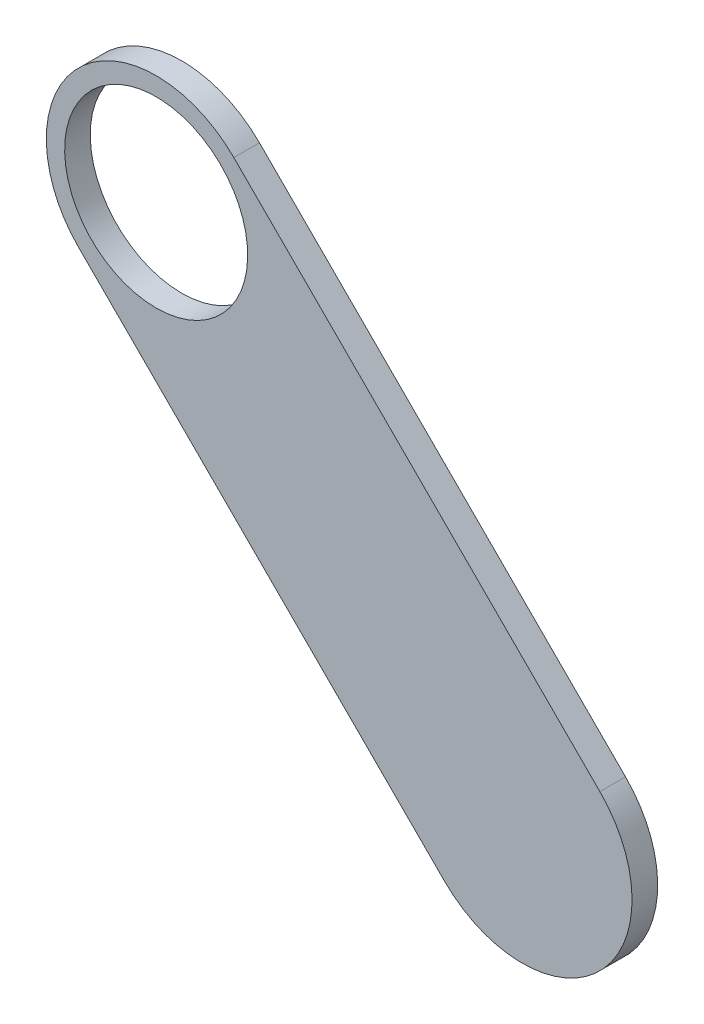
ISO-10303-21;
HEADER;
FILE_DESCRIPTION(('STEP AP214'),'2;1');
FILE_NAME('part.step','',(''),(''),'','','');
FILE_SCHEMA(('AUTOMOTIVE_DESIGN { 1 0 10303 214 1 1 1 1 }'));
ENDSEC;
DATA;
#1=APPLICATION_CONTEXT('core data for automotive mechanical design processes');
#2=APPLICATION_PROTOCOL_DEFINITION('international standard','automotive_design',2000,#1);
#3=PRODUCT_CONTEXT('',#1,'mechanical');
#4=PRODUCT('Part','Part','',(#3));
#5=PRODUCT_RELATED_PRODUCT_CATEGORY('part','',(#4));
#6=PRODUCT_DEFINITION_FORMATION('','',#4);
#7=PRODUCT_DEFINITION_CONTEXT('part definition',#1,'design');
#8=PRODUCT_DEFINITION('design','',#6,#7);
#9=PRODUCT_DEFINITION_SHAPE('','',#8);
#10=(LENGTH_UNIT() NAMED_UNIT(*) SI_UNIT(.MILLI.,.METRE.));
#11=(NAMED_UNIT(*) PLANE_ANGLE_UNIT() SI_UNIT($,.RADIAN.));
#12=(NAMED_UNIT(*) SI_UNIT($,.STERADIAN.) SOLID_ANGLE_UNIT());
#13=UNCERTAINTY_MEASURE_WITH_UNIT(LENGTH_MEASURE(1.E-05),#10,'distance_accuracy_value','');
#14=(GEOMETRIC_REPRESENTATION_CONTEXT(3) GLOBAL_UNCERTAINTY_ASSIGNED_CONTEXT((#13)) GLOBAL_UNIT_ASSIGNED_CONTEXT((#10,
#11,#12)) REPRESENTATION_CONTEXT('',''));
#15=CARTESIAN_POINT('',(0.,0.,0.));
#16=DIRECTION('',(0.,0.,1.));
#17=DIRECTION('',(1.,0.,0.));
#18=AXIS2_PLACEMENT_3D('',#15,#16,#17);
#19=CARTESIAN_POINT('',(95.8,-131.,-0.045));
#20=DIRECTION('',(0.,0.,-1.));
#21=DIRECTION('',(0.,-1.,0.));
#22=AXIS2_PLACEMENT_3D('',#19,#20,#21);
#23=CYLINDRICAL_SURFACE('',#22,0.125);
#24=CARTESIAN_POINT('',(95.8,-131.,1.6));
#25=DIRECTION('',(0.,0.,-1.));
#26=DIRECTION('',(0.,-1.,0.));
#27=AXIS2_PLACEMENT_3D('',#24,#25,#26);
#28=CIRCLE('',#27,0.125);
#29=CARTESIAN_POINT('',(95.8,-131.125,1.6));
#30=VERTEX_POINT('',#29);
#31=EDGE_CURVE('E70',#30,#30,#28,.T.);
#32=ORIENTED_EDGE('',*,*,#31,.T.);
#33=DIRECTION('',(0.,0.,1.));
#34=VECTOR('',#33,1.);
#35=CARTESIAN_POINT('',(95.8,-131.125,-0.045));
#36=LINE('',#35,#34);
#37=CARTESIAN_POINT('',(95.8,-131.125,1.635));
#38=VERTEX_POINT('',#37);
#39=EDGE_CURVE('E11',#30,#38,#36,.T.);
#40=ORIENTED_EDGE('',*,*,#39,.T.);
#41=CARTESIAN_POINT('',(95.8,-131.,1.635));
#42=DIRECTION('',(0.,0.,-1.));
#43=DIRECTION('',(0.,-1.,0.));
#44=AXIS2_PLACEMENT_3D('',#41,#42,#43);
#45=CIRCLE('',#44,0.125);
#46=EDGE_CURVE('E26',#38,#38,#45,.T.);
#47=ORIENTED_EDGE('',*,*,#46,.F.);
#48=ORIENTED_EDGE('',*,*,#39,.F.);
#49=EDGE_LOOP('',(#32,#40,#47,#48));
#50=FACE_BOUND('',#49,.T.);
#51=ADVANCED_FACE('F17',(#50),#23,.F.);
#52=CARTESIAN_POINT('',(96.406066,-131.393933,1.6));
#53=DIRECTION('',(-0.707106781186548,-0.707106781186548,0.));
#54=DIRECTION('',(-0.707106781186548,0.707106781186548,0.));
#55=AXIS2_PLACEMENT_3D('',#52,#53,#54);
#56=PLANE('',#55);
#57=DIRECTION('',(-0.707106781186548,0.707106781186548,0.));
#58=VECTOR('',#57,1.);
#59=CARTESIAN_POINT('',(96.406066,-131.393933,1.6));
#60=LINE('',#59,#58);
#61=CARTESIAN_POINT('',(96.406066,-131.393933,1.6));
#62=VERTEX_POINT('',#61);
#63=CARTESIAN_POINT('',(95.906066,-130.893933,1.6));
#64=VERTEX_POINT('',#63);
#65=EDGE_CURVE('E82',#62,#64,#60,.T.);
#66=ORIENTED_EDGE('',*,*,#65,.T.);
#67=DIRECTION('',(0.,0.,1.));
#68=VECTOR('',#67,1.);
#69=CARTESIAN_POINT('',(95.906066,-130.893933,1.6));
#70=LINE('',#69,#68);
#71=CARTESIAN_POINT('',(95.906066,-130.893933,1.635));
#72=VERTEX_POINT('',#71);
#73=EDGE_CURVE('E65',#64,#72,#70,.T.);
#74=ORIENTED_EDGE('',*,*,#73,.T.);
#75=DIRECTION('',(-0.707106781186548,0.707106781186548,0.));
#76=VECTOR('',#75,1.);
#77=CARTESIAN_POINT('',(96.406066,-131.393933,1.635));
#78=LINE('',#77,#76);
#79=CARTESIAN_POINT('',(96.406066,-131.393933,1.635));
#80=VERTEX_POINT('',#79);
#81=EDGE_CURVE('E58',#80,#72,#78,.T.);
#82=ORIENTED_EDGE('',*,*,#81,.F.);
#83=DIRECTION('',(0.,0.,1.));
#84=VECTOR('',#83,1.);
#85=CARTESIAN_POINT('',(96.406066,-131.393933,1.6));
#86=LINE('',#85,#84);
#87=EDGE_CURVE('E62',#62,#80,#86,.T.);
#88=ORIENTED_EDGE('',*,*,#87,.F.);
#89=EDGE_LOOP('',(#66,#74,#82,#88));
#90=FACE_BOUND('',#89,.T.);
#91=ADVANCED_FACE('F60',(#90),#56,.F.);
#92=CARTESIAN_POINT('',(95.693933,-131.106066,1.635));
#93=DIRECTION('',(0.,0.,1.));
#94=DIRECTION('',(1.,0.,0.));
#95=AXIS2_PLACEMENT_3D('',#92,#93,#94);
#96=PLANE('',#95);
#97=ORIENTED_EDGE('',*,*,#46,.T.);
#98=EDGE_LOOP('',(#97));
#99=FACE_BOUND('',#98,.T.);
#100=DIRECTION('',(0.707106781186548,-0.707106781186548,0.));
#101=VECTOR('',#100,1.);
#102=CARTESIAN_POINT('',(95.693933,-131.106066,1.635));
#103=LINE('',#102,#101);
#104=CARTESIAN_POINT('',(95.693933,-131.106066,1.635));
#105=VERTEX_POINT('',#104);
#106=CARTESIAN_POINT('',(96.193933,-131.606066,1.635));
#107=VERTEX_POINT('',#106);
#108=EDGE_CURVE('E77',#105,#107,#103,.T.);
#109=ORIENTED_EDGE('',*,*,#108,.T.);
#110=CARTESIAN_POINT('',(96.2999995,-131.4999995,1.635));
#111=DIRECTION('',(0.,0.,1.));
#112=DIRECTION('',(-0.707106781186548,-0.707106781186548,0.));
#113=AXIS2_PLACEMENT_3D('',#110,#111,#112);
#114=CIRCLE('',#113,0.150000682813);
#115=EDGE_CURVE('E73',#107,#80,#114,.T.);
#116=ORIENTED_EDGE('',*,*,#115,.T.);
#117=ORIENTED_EDGE('',*,*,#81,.T.);
#118=CARTESIAN_POINT('',(95.7999995,-130.9999995,1.635));
#119=DIRECTION('',(0.,0.,1.));
#120=DIRECTION('',(0.707106781186548,0.707106781186548,0.));
#121=AXIS2_PLACEMENT_3D('',#118,#119,#120);
#122=CIRCLE('',#121,0.150000682813);
#123=EDGE_CURVE('E98',#72,#105,#122,.T.);
#124=ORIENTED_EDGE('',*,*,#123,.T.);
#125=EDGE_LOOP('',(#109,#116,#117,#124));
#126=FACE_BOUND('',#125,.T.);
#127=ADVANCED_FACE('F74',(#99,#126),#96,.T.);
#128=CARTESIAN_POINT('',(95.693933,-131.106066,1.6));
#129=DIRECTION('',(0.,0.,1.));
#130=DIRECTION('',(1.,0.,0.));
#131=AXIS2_PLACEMENT_3D('',#128,#129,#130);
#132=PLANE('',#131);
#133=ORIENTED_EDGE('',*,*,#31,.F.);
#134=EDGE_LOOP('',(#133));
#135=FACE_BOUND('',#134,.T.);
#136=CARTESIAN_POINT('',(95.7999995,-130.9999995,1.6));
#137=DIRECTION('',(0.,0.,1.));
#138=DIRECTION('',(0.707106781186548,0.707106781186548,0.));
#139=AXIS2_PLACEMENT_3D('',#136,#137,#138);
#140=CIRCLE('',#139,0.150000682813);
#141=CARTESIAN_POINT('',(95.693933,-131.106066,1.6));
#142=VERTEX_POINT('',#141);
#143=EDGE_CURVE('E101',#64,#142,#140,.T.);
#144=ORIENTED_EDGE('',*,*,#143,.F.);
#145=ORIENTED_EDGE('',*,*,#65,.F.);
#146=CARTESIAN_POINT('',(96.2999995,-131.4999995,1.6));
#147=DIRECTION('',(0.,0.,1.));
#148=DIRECTION('',(-0.707106781186548,-0.707106781186548,0.));
#149=AXIS2_PLACEMENT_3D('',#146,#147,#148);
#150=CIRCLE('',#149,0.150000682813);
#151=CARTESIAN_POINT('',(96.193933,-131.606066,1.6));
#152=VERTEX_POINT('',#151);
#153=EDGE_CURVE('E86',#152,#62,#150,.T.);
#154=ORIENTED_EDGE('',*,*,#153,.F.);
#155=DIRECTION('',(0.707106781186548,-0.707106781186548,0.));
#156=VECTOR('',#155,1.);
#157=CARTESIAN_POINT('',(95.693933,-131.106066,1.6));
#158=LINE('',#157,#156);
#159=EDGE_CURVE('E120',#142,#152,#158,.T.);
#160=ORIENTED_EDGE('',*,*,#159,.F.);
#161=EDGE_LOOP('',(#144,#145,#154,#160));
#162=FACE_BOUND('',#161,.T.);
#163=ADVANCED_FACE('F111',(#135,#162),#132,.F.);
#164=CARTESIAN_POINT('',(96.2999995,-131.4999995,1.6));
#165=DIRECTION('',(0.,0.,-1.));
#166=DIRECTION('',(-0.707106781186548,-0.707106781186548,0.));
#167=AXIS2_PLACEMENT_3D('',#164,#165,#166);
#168=CYLINDRICAL_SURFACE('',#167,0.150000682813);
#169=ORIENTED_EDGE('',*,*,#153,.T.);
#170=ORIENTED_EDGE('',*,*,#87,.T.);
#171=ORIENTED_EDGE('',*,*,#115,.F.);
#172=DIRECTION('',(0.,0.,1.));
#173=VECTOR('',#172,1.);
#174=CARTESIAN_POINT('',(96.193933,-131.606066,1.6));
#175=LINE('',#174,#173);
#176=EDGE_CURVE('E132',#152,#107,#175,.T.);
#177=ORIENTED_EDGE('',*,*,#176,.F.);
#178=EDGE_LOOP('',(#169,#170,#171,#177));
#179=FACE_BOUND('',#178,.T.);
#180=ADVANCED_FACE('F84',(#179),#168,.T.);
#181=CARTESIAN_POINT('',(95.7999995,-130.9999995,1.6));
#182=DIRECTION('',(0.,0.,-1.));
#183=DIRECTION('',(0.707106781186548,0.707106781186548,0.));
#184=AXIS2_PLACEMENT_3D('',#181,#182,#183);
#185=CYLINDRICAL_SURFACE('',#184,0.150000682813);
#186=ORIENTED_EDGE('',*,*,#143,.T.);
#187=DIRECTION('',(0.,0.,1.));
#188=VECTOR('',#187,1.);
#189=CARTESIAN_POINT('',(95.693933,-131.106066,1.6));
#190=LINE('',#189,#188);
#191=EDGE_CURVE('E95',#142,#105,#190,.T.);
#192=ORIENTED_EDGE('',*,*,#191,.T.);
#193=ORIENTED_EDGE('',*,*,#123,.F.);
#194=ORIENTED_EDGE('',*,*,#73,.F.);
#195=EDGE_LOOP('',(#186,#192,#193,#194));
#196=FACE_BOUND('',#195,.T.);
#197=ADVANCED_FACE('F158',(#196),#185,.T.);
#198=CARTESIAN_POINT('',(95.693933,-131.106066,1.6));
#199=DIRECTION('',(0.707106781186548,0.707106781186548,0.));
#200=DIRECTION('',(0.,0.,-1.));
#201=AXIS2_PLACEMENT_3D('',#198,#199,#200);
#202=PLANE('',#201);
#203=ORIENTED_EDGE('',*,*,#159,.T.);
#204=ORIENTED_EDGE('',*,*,#176,.T.);
#205=ORIENTED_EDGE('',*,*,#108,.F.);
#206=ORIENTED_EDGE('',*,*,#191,.F.);
#207=EDGE_LOOP('',(#203,#204,#205,#206));
#208=FACE_BOUND('',#207,.T.);
#209=ADVANCED_FACE('F144',(#208),#202,.F.);
#210=CLOSED_SHELL('',(#51,#91,#127,#163,#180,#197,#209));
#211=MANIFOLD_SOLID_BREP('B1',#210);
#212=ADVANCED_BREP_SHAPE_REPRESENTATION('',(#18,#211),#14);
#213=SHAPE_DEFINITION_REPRESENTATION(#9,#212);
ENDSEC;
END-ISO-10303-21;
